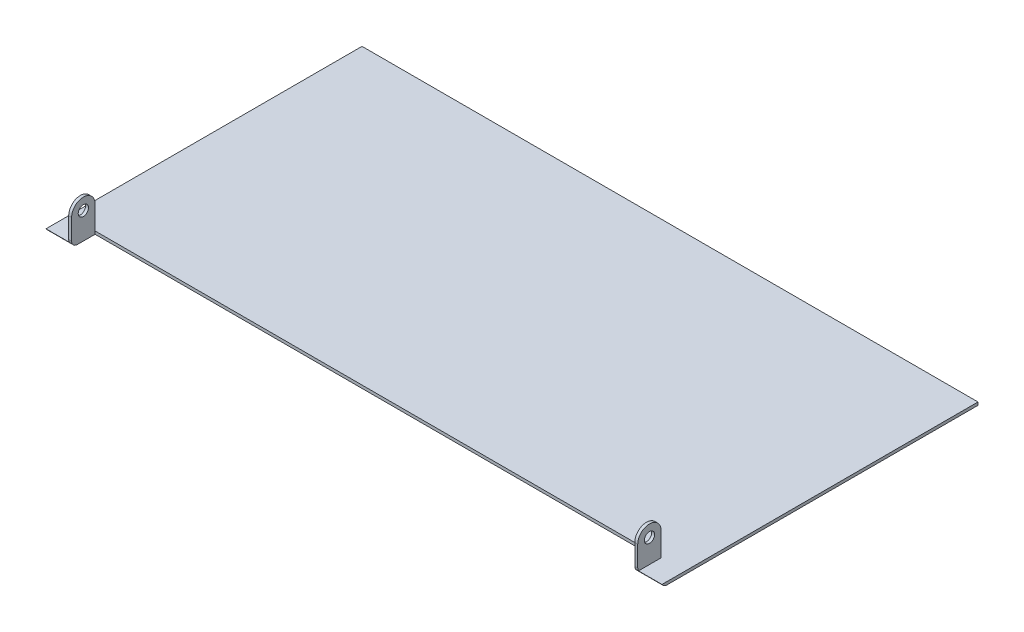
ISO-10303-21;
HEADER;
FILE_DESCRIPTION(('STEP AP214'),'2;1');
FILE_NAME('part.step','',(''),(''),'','','');
FILE_SCHEMA(('AUTOMOTIVE_DESIGN { 1 0 10303 214 1 1 1 1 }'));
ENDSEC;
DATA;
#1=APPLICATION_CONTEXT('core data for automotive mechanical design processes');
#2=APPLICATION_PROTOCOL_DEFINITION('international standard','automotive_design',2000,#1);
#3=PRODUCT_CONTEXT('',#1,'mechanical');
#4=PRODUCT('Part','Part','',(#3));
#5=PRODUCT_RELATED_PRODUCT_CATEGORY('part','',(#4));
#6=PRODUCT_DEFINITION_FORMATION('','',#4);
#7=PRODUCT_DEFINITION_CONTEXT('part definition',#1,'design');
#8=PRODUCT_DEFINITION('design','',#6,#7);
#9=PRODUCT_DEFINITION_SHAPE('','',#8);
#10=(LENGTH_UNIT() NAMED_UNIT(*) SI_UNIT(.MILLI.,.METRE.));
#11=(NAMED_UNIT(*) PLANE_ANGLE_UNIT() SI_UNIT($,.RADIAN.));
#12=(NAMED_UNIT(*) SI_UNIT($,.STERADIAN.) SOLID_ANGLE_UNIT());
#13=UNCERTAINTY_MEASURE_WITH_UNIT(LENGTH_MEASURE(1.E-05),#10,'distance_accuracy_value','');
#14=(GEOMETRIC_REPRESENTATION_CONTEXT(3) GLOBAL_UNCERTAINTY_ASSIGNED_CONTEXT((#13)) GLOBAL_UNIT_ASSIGNED_CONTEXT((#10,
#11,#12)) REPRESENTATION_CONTEXT('',''));
#15=CARTESIAN_POINT('',(0.,0.,0.));
#16=DIRECTION('',(0.,0.,1.));
#17=DIRECTION('',(1.,0.,0.));
#18=AXIS2_PLACEMENT_3D('',#15,#16,#17);
#19=CARTESIAN_POINT('',(0.,0.,0.));
#20=DIRECTION('',(0.,1.,0.));
#21=DIRECTION('',(0.,0.,1.));
#22=AXIS2_PLACEMENT_3D('',#19,#20,#21);
#23=PLANE('',#22);
#24=DIRECTION('',(-1.,0.,0.));
#25=VECTOR('',#24,1.);
#26=CARTESIAN_POINT('',(105.000025,0.,56.));
#27=LINE('',#26,#25);
#28=CARTESIAN_POINT('',(-96.,0.,56.));
#29=VERTEX_POINT('',#28);
#30=CARTESIAN_POINT('',(-105.,0.,56.));
#31=VERTEX_POINT('',#30);
#32=EDGE_CURVE('E143',#29,#31,#27,.T.);
#33=ORIENTED_EDGE('',*,*,#32,.T.);
#34=DIRECTION('',(0.,0.,1.));
#35=VECTOR('',#34,1.);
#36=CARTESIAN_POINT('',(-105.,0.,-50.));
#37=LINE('',#36,#35);
#38=CARTESIAN_POINT('',(-105.,0.,-50.));
#39=VERTEX_POINT('',#38);
#40=EDGE_CURVE('E155',#39,#31,#37,.T.);
#41=ORIENTED_EDGE('',*,*,#40,.F.);
#42=DIRECTION('',(-1.,0.,0.));
#43=VECTOR('',#42,1.);
#44=CARTESIAN_POINT('',(97.,0.,-50.));
#45=LINE('',#44,#43);
#46=CARTESIAN_POINT('',(105.,0.,-50.));
#47=VERTEX_POINT('',#46);
#48=EDGE_CURVE('E233',#47,#39,#45,.T.);
#49=ORIENTED_EDGE('',*,*,#48,.F.);
#50=DIRECTION('',(0.,0.,-1.));
#51=VECTOR('',#50,1.);
#52=CARTESIAN_POINT('',(105.,0.,-50.));
#53=LINE('',#52,#51);
#54=CARTESIAN_POINT('',(105.0000025,0.,56.));
#55=VERTEX_POINT('',#54);
#56=EDGE_CURVE('E39',#55,#47,#53,.T.);
#57=ORIENTED_EDGE('',*,*,#56,.F.);
#58=CARTESIAN_POINT('',(96.,0.,56.));
#59=VERTEX_POINT('',#58);
#60=EDGE_CURVE('E59',#55,#59,#27,.T.);
#61=ORIENTED_EDGE('',*,*,#60,.T.);
#62=DIRECTION('',(0.,0.,1.));
#63=VECTOR('',#62,1.);
#64=CARTESIAN_POINT('',(96.,0.,58.));
#65=LINE('',#64,#63);
#66=CARTESIAN_POINT('',(96.,0.,50.));
#67=VERTEX_POINT('',#66);
#68=EDGE_CURVE('E187',#67,#59,#65,.T.);
#69=ORIENTED_EDGE('',*,*,#68,.F.);
#70=DIRECTION('',(1.,0.,0.));
#71=VECTOR('',#70,1.);
#72=CARTESIAN_POINT('',(97.,0.,50.));
#73=LINE('',#72,#71);
#74=CARTESIAN_POINT('',(-96.,0.,50.));
#75=VERTEX_POINT('',#74);
#76=EDGE_CURVE('E225',#75,#67,#73,.T.);
#77=ORIENTED_EDGE('',*,*,#76,.F.);
#78=DIRECTION('',(0.,0.,1.));
#79=VECTOR('',#78,1.);
#80=CARTESIAN_POINT('',(-96.,0.,58.));
#81=LINE('',#80,#79);
#82=EDGE_CURVE('E157',#75,#29,#81,.T.);
#83=ORIENTED_EDGE('',*,*,#82,.T.);
#84=EDGE_LOOP('',(#33,#41,#49,#57,#61,#69,#77,#83));
#85=FACE_BOUND('',#84,.T.);
#86=ADVANCED_FACE('F35',(#85),#23,.F.);
#87=CARTESIAN_POINT('',(-96.,0.,58.));
#88=DIRECTION('',(0.,0.,1.));
#89=DIRECTION('',(1.,0.,0.));
#90=AXIS2_PLACEMENT_3D('',#87,#88,#89);
#91=PLANE('',#90);
#92=DIRECTION('',(0.,1.,0.));
#93=VECTOR('',#92,1.);
#94=CARTESIAN_POINT('',(-97.,0.,58.));
#95=LINE('',#94,#93);
#96=CARTESIAN_POINT('',(-97.,2.,58.));
#97=VERTEX_POINT('',#96);
#98=CARTESIAN_POINT('',(-97.,9.,58.));
#99=VERTEX_POINT('',#98);
#100=EDGE_CURVE('E177',#97,#99,#95,.T.);
#101=ORIENTED_EDGE('',*,*,#100,.F.);
#102=DIRECTION('',(-1.,0.,0.));
#103=VECTOR('',#102,1.);
#104=CARTESIAN_POINT('',(105.000025,2.,58.));
#105=LINE('',#104,#103);
#106=CARTESIAN_POINT('',(-96.,2.,58.));
#107=VERTEX_POINT('',#106);
#108=EDGE_CURVE('E149',#107,#97,#105,.T.);
#109=ORIENTED_EDGE('',*,*,#108,.F.);
#110=DIRECTION('',(0.,1.,0.));
#111=VECTOR('',#110,1.);
#112=CARTESIAN_POINT('',(-96.,0.,58.));
#113=LINE('',#112,#111);
#114=CARTESIAN_POINT('',(-96.,9.,58.));
#115=VERTEX_POINT('',#114);
#116=EDGE_CURVE('E208',#107,#115,#113,.T.);
#117=ORIENTED_EDGE('',*,*,#116,.T.);
#118=DIRECTION('',(-1.,0.,0.));
#119=VECTOR('',#118,1.);
#120=CARTESIAN_POINT('',(-96.,9.,58.));
#121=LINE('',#120,#119);
#122=EDGE_CURVE('E217',#115,#99,#121,.T.);
#123=ORIENTED_EDGE('',*,*,#122,.T.);
#124=EDGE_LOOP('',(#101,#109,#117,#123));
#125=FACE_BOUND('',#124,.T.);
#126=ADVANCED_FACE('F278',(#125),#91,.T.);
#127=CARTESIAN_POINT('',(97.,1.,50.));
#128=DIRECTION('',(-1.,0.,0.));
#129=DIRECTION('',(0.,0.,1.));
#130=AXIS2_PLACEMENT_3D('',#127,#128,#129);
#131=PLANE('',#130);
#132=CARTESIAN_POINT('',(97.,9.,54.));
#133=DIRECTION('',(-1.,0.,0.));
#134=DIRECTION('',(0.,0.,1.));
#135=AXIS2_PLACEMENT_3D('',#132,#133,#134);
#136=CIRCLE('',#135,1.75);
#137=CARTESIAN_POINT('',(97.,9.,55.75));
#138=VERTEX_POINT('',#137);
#139=EDGE_CURVE('E166',#138,#138,#136,.T.);
#140=ORIENTED_EDGE('',*,*,#139,.T.);
#141=EDGE_LOOP('',(#140));
#142=FACE_BOUND('',#141,.T.);
#143=DIRECTION('',(0.,1.,0.));
#144=VECTOR('',#143,1.);
#145=CARTESIAN_POINT('',(97.,0.,58.));
#146=LINE('',#145,#144);
#147=CARTESIAN_POINT('',(97.,2.,58.));
#148=VERTEX_POINT('',#147);
#149=CARTESIAN_POINT('',(97.,9.,58.));
#150=VERTEX_POINT('',#149);
#151=EDGE_CURVE('E185',#148,#150,#146,.T.);
#152=ORIENTED_EDGE('',*,*,#151,.F.);
#153=CARTESIAN_POINT('',(97.,2.00000000000002,56.));
#154=DIRECTION('',(-1.,0.,0.));
#155=DIRECTION('',(0.,0.,1.));
#156=AXIS2_PLACEMENT_3D('',#153,#154,#155);
#157=CIRCLE('',#156,2.00000000000002);
#158=CARTESIAN_POINT('',(97.,1.,57.7320508075689));
#159=VERTEX_POINT('',#158);
#160=EDGE_CURVE('E270',#148,#159,#157,.F.);
#161=ORIENTED_EDGE('',*,*,#160,.T.);
#162=DIRECTION('',(0.,0.,1.));
#163=VECTOR('',#162,1.);
#164=CARTESIAN_POINT('',(97.,1.,-50.));
#165=LINE('',#164,#163);
#166=CARTESIAN_POINT('',(97.,1.,50.));
#167=VERTEX_POINT('',#166);
#168=EDGE_CURVE('E45',#167,#159,#165,.T.);
#169=ORIENTED_EDGE('',*,*,#168,.F.);
#170=DIRECTION('',(0.,-1.,0.));
#171=VECTOR('',#170,1.);
#172=CARTESIAN_POINT('',(97.,0.,50.));
#173=LINE('',#172,#171);
#174=CARTESIAN_POINT('',(97.,9.,50.));
#175=VERTEX_POINT('',#174);
#176=EDGE_CURVE('E328',#175,#167,#173,.T.);
#177=ORIENTED_EDGE('',*,*,#176,.F.);
#178=CARTESIAN_POINT('',(97.,9.,54.));
#179=DIRECTION('',(-1.,0.,0.));
#180=DIRECTION('',(0.,0.,-1.));
#181=AXIS2_PLACEMENT_3D('',#178,#179,#180);
#182=CIRCLE('',#181,4.);
#183=EDGE_CURVE('E188',#150,#175,#182,.T.);
#184=ORIENTED_EDGE('',*,*,#183,.F.);
#185=EDGE_LOOP('',(#152,#161,#169,#177,#184));
#186=FACE_BOUND('',#185,.T.);
#187=ADVANCED_FACE('F330',(#142,#186),#131,.F.);
#188=CARTESIAN_POINT('',(-97.,1.,50.));
#189=DIRECTION('',(1.,0.,0.));
#190=DIRECTION('',(0.,0.,-1.));
#191=AXIS2_PLACEMENT_3D('',#188,#189,#190);
#192=PLANE('',#191);
#193=CARTESIAN_POINT('',(-97.,9.,54.));
#194=DIRECTION('',(-1.,0.,0.));
#195=DIRECTION('',(0.,0.,1.));
#196=AXIS2_PLACEMENT_3D('',#193,#194,#195);
#197=CIRCLE('',#196,1.75);
#198=CARTESIAN_POINT('',(-97.,9.,55.75));
#199=VERTEX_POINT('',#198);
#200=EDGE_CURVE('E204',#199,#199,#197,.T.);
#201=ORIENTED_EDGE('',*,*,#200,.F.);
#202=EDGE_LOOP('',(#201));
#203=FACE_BOUND('',#202,.T.);
#204=DIRECTION('',(0.,0.,-1.));
#205=VECTOR('',#204,1.);
#206=CARTESIAN_POINT('',(-97.,1.,-50.));
#207=LINE('',#206,#205);
#208=CARTESIAN_POINT('',(-97.,1.,57.7320508075689));
#209=VERTEX_POINT('',#208);
#210=CARTESIAN_POINT('',(-97.,1.,50.));
#211=VERTEX_POINT('',#210);
#212=EDGE_CURVE('E168',#209,#211,#207,.T.);
#213=ORIENTED_EDGE('',*,*,#212,.F.);
#214=CARTESIAN_POINT('',(-97.,2.00000000000002,56.));
#215=DIRECTION('',(1.,0.,0.));
#216=DIRECTION('',(0.,0.,-1.));
#217=AXIS2_PLACEMENT_3D('',#214,#215,#216);
#218=CIRCLE('',#217,2.00000000000002);
#219=EDGE_CURVE('E252',#209,#97,#218,.F.);
#220=ORIENTED_EDGE('',*,*,#219,.T.);
#221=ORIENTED_EDGE('',*,*,#100,.T.);
#222=CARTESIAN_POINT('',(-97.,9.,54.));
#223=DIRECTION('',(-1.,0.,0.));
#224=DIRECTION('',(0.,0.,-1.));
#225=AXIS2_PLACEMENT_3D('',#222,#223,#224);
#226=CIRCLE('',#225,4.);
#227=CARTESIAN_POINT('',(-97.,9.,50.));
#228=VERTEX_POINT('',#227);
#229=EDGE_CURVE('E220',#99,#228,#226,.T.);
#230=ORIENTED_EDGE('',*,*,#229,.T.);
#231=DIRECTION('',(0.,-1.,0.));
#232=VECTOR('',#231,1.);
#233=CARTESIAN_POINT('',(-97.,0.,50.));
#234=LINE('',#233,#232);
#235=EDGE_CURVE('E209',#228,#211,#234,.T.);
#236=ORIENTED_EDGE('',*,*,#235,.T.);
#237=EDGE_LOOP('',(#213,#220,#221,#230,#236));
#238=FACE_BOUND('',#237,.T.);
#239=ADVANCED_FACE('F37',(#203,#238),#192,.F.);
#240=CARTESIAN_POINT('',(97.,1.,50.));
#241=DIRECTION('',(0.,0.,-1.));
#242=DIRECTION('',(-1.,0.,0.));
#243=AXIS2_PLACEMENT_3D('',#240,#241,#242);
#244=PLANE('',#243);
#245=ORIENTED_EDGE('',*,*,#76,.T.);
#246=DIRECTION('',(0.,-1.,0.));
#247=VECTOR('',#246,1.);
#248=CARTESIAN_POINT('',(96.,0.,50.));
#249=LINE('',#248,#247);
#250=CARTESIAN_POINT('',(96.,1.,50.));
#251=VERTEX_POINT('',#250);
#252=EDGE_CURVE('E299',#251,#67,#249,.T.);
#253=ORIENTED_EDGE('',*,*,#252,.F.);
#254=DIRECTION('',(1.,0.,0.));
#255=VECTOR('',#254,1.);
#256=CARTESIAN_POINT('',(97.,1.,50.));
#257=LINE('',#256,#255);
#258=CARTESIAN_POINT('',(-96.,1.,50.));
#259=VERTEX_POINT('',#258);
#260=EDGE_CURVE('E228',#259,#251,#257,.T.);
#261=ORIENTED_EDGE('',*,*,#260,.F.);
#262=DIRECTION('',(0.,-1.,0.));
#263=VECTOR('',#262,1.);
#264=CARTESIAN_POINT('',(-96.,0.,50.));
#265=LINE('',#264,#263);
#266=EDGE_CURVE('E214',#259,#75,#265,.T.);
#267=ORIENTED_EDGE('',*,*,#266,.T.);
#268=EDGE_LOOP('',(#245,#253,#261,#267));
#269=FACE_BOUND('',#268,.T.);
#270=ADVANCED_FACE('F297',(#269),#244,.F.);
#271=CARTESIAN_POINT('',(97.,1.,-50.));
#272=DIRECTION('',(0.,0.,1.));
#273=DIRECTION('',(1.,0.,0.));
#274=AXIS2_PLACEMENT_3D('',#271,#272,#273);
#275=PLANE('',#274);
#276=ORIENTED_EDGE('',*,*,#48,.T.);
#277=DIRECTION('',(0.,1.,0.));
#278=VECTOR('',#277,1.);
#279=CARTESIAN_POINT('',(-105.,0.,-50.));
#280=LINE('',#279,#278);
#281=CARTESIAN_POINT('',(-105.,1.,-50.));
#282=VERTEX_POINT('',#281);
#283=EDGE_CURVE('E163',#39,#282,#280,.T.);
#284=ORIENTED_EDGE('',*,*,#283,.T.);
#285=DIRECTION('',(-1.,0.,0.));
#286=VECTOR('',#285,1.);
#287=CARTESIAN_POINT('',(97.,1.,-50.));
#288=LINE('',#287,#286);
#289=CARTESIAN_POINT('',(105.,1.,-50.));
#290=VERTEX_POINT('',#289);
#291=EDGE_CURVE('E234',#290,#282,#288,.T.);
#292=ORIENTED_EDGE('',*,*,#291,.F.);
#293=DIRECTION('',(0.,1.,0.));
#294=VECTOR('',#293,1.);
#295=CARTESIAN_POINT('',(105.,0.,-50.));
#296=LINE('',#295,#294);
#297=EDGE_CURVE('E172',#47,#290,#296,.T.);
#298=ORIENTED_EDGE('',*,*,#297,.F.);
#299=EDGE_LOOP('',(#276,#284,#292,#298));
#300=FACE_BOUND('',#299,.T.);
#301=ADVANCED_FACE('F338',(#300),#275,.F.);
#302=CARTESIAN_POINT('',(0.,1.,0.));
#303=DIRECTION('',(0.,1.,0.));
#304=DIRECTION('',(0.,0.,1.));
#305=AXIS2_PLACEMENT_3D('',#302,#303,#304);
#306=PLANE('',#305);
#307=DIRECTION('',(-1.,0.,0.));
#308=VECTOR('',#307,1.);
#309=CARTESIAN_POINT('',(105.000025,1.,57.7320508075689));
#310=LINE('',#309,#308);
#311=CARTESIAN_POINT('',(105.,1.,57.7320508075689));
#312=VERTEX_POINT('',#311);
#313=EDGE_CURVE('E264',#312,#159,#310,.T.);
#314=ORIENTED_EDGE('',*,*,#313,.F.);
#315=DIRECTION('',(0.,0.,-1.));
#316=VECTOR('',#315,1.);
#317=CARTESIAN_POINT('',(105.,1.,-50.));
#318=LINE('',#317,#316);
#319=EDGE_CURVE('E251',#312,#290,#318,.T.);
#320=ORIENTED_EDGE('',*,*,#319,.T.);
#321=ORIENTED_EDGE('',*,*,#291,.T.);
#322=DIRECTION('',(0.,0.,1.));
#323=VECTOR('',#322,1.);
#324=CARTESIAN_POINT('',(-105.,1.,-50.));
#325=LINE('',#324,#323);
#326=CARTESIAN_POINT('',(-105.,1.,57.7320508075689));
#327=VERTEX_POINT('',#326);
#328=EDGE_CURVE('E164',#282,#327,#325,.T.);
#329=ORIENTED_EDGE('',*,*,#328,.T.);
#330=EDGE_CURVE('E52',#209,#327,#310,.T.);
#331=ORIENTED_EDGE('',*,*,#330,.F.);
#332=ORIENTED_EDGE('',*,*,#212,.T.);
#333=EDGE_CURVE('E232',#211,#259,#257,.T.);
#334=ORIENTED_EDGE('',*,*,#333,.T.);
#335=ORIENTED_EDGE('',*,*,#260,.T.);
#336=DIRECTION('',(1.,0.,0.));
#337=VECTOR('',#336,1.);
#338=CARTESIAN_POINT('',(0.,1.,50.));
#339=LINE('',#338,#337);
#340=EDGE_CURVE('E196',#251,#167,#339,.T.);
#341=ORIENTED_EDGE('',*,*,#340,.T.);
#342=ORIENTED_EDGE('',*,*,#168,.T.);
#343=EDGE_LOOP('',(#314,#320,#321,#329,#331,#332,#334,#335,#341,#342));
#344=FACE_BOUND('',#343,.T.);
#345=ADVANCED_FACE('F292',(#344),#306,.T.);
#346=CARTESIAN_POINT('',(-96.,0.,50.));
#347=DIRECTION('',(0.,0.,-1.));
#348=DIRECTION('',(-1.,0.,0.));
#349=AXIS2_PLACEMENT_3D('',#346,#347,#348);
#350=PLANE('',#349);
#351=CARTESIAN_POINT('',(-96.,9.,50.));
#352=VERTEX_POINT('',#351);
#353=EDGE_CURVE('E215',#352,#259,#265,.T.);
#354=ORIENTED_EDGE('',*,*,#353,.T.);
#355=ORIENTED_EDGE('',*,*,#333,.F.);
#356=ORIENTED_EDGE('',*,*,#235,.F.);
#357=DIRECTION('',(-1.,0.,0.));
#358=VECTOR('',#357,1.);
#359=CARTESIAN_POINT('',(-96.,9.,50.));
#360=LINE('',#359,#358);
#361=EDGE_CURVE('E223',#352,#228,#360,.T.);
#362=ORIENTED_EDGE('',*,*,#361,.F.);
#363=EDGE_LOOP('',(#354,#355,#356,#362));
#364=FACE_BOUND('',#363,.T.);
#365=ADVANCED_FACE('F291',(#364),#350,.T.);
#366=CARTESIAN_POINT('',(-96.,9.,54.));
#367=DIRECTION('',(-1.,0.,0.));
#368=DIRECTION('',(0.,0.,1.));
#369=AXIS2_PLACEMENT_3D('',#366,#367,#368);
#370=CYLINDRICAL_SURFACE('',#369,4.);
#371=ORIENTED_EDGE('',*,*,#229,.F.);
#372=ORIENTED_EDGE('',*,*,#122,.F.);
#373=CARTESIAN_POINT('',(-96.,9.,54.));
#374=DIRECTION('',(-1.,0.,0.));
#375=DIRECTION('',(0.,0.,-1.));
#376=AXIS2_PLACEMENT_3D('',#373,#374,#375);
#377=CIRCLE('',#376,4.);
#378=EDGE_CURVE('E211',#115,#352,#377,.T.);
#379=ORIENTED_EDGE('',*,*,#378,.T.);
#380=ORIENTED_EDGE('',*,*,#361,.T.);
#381=EDGE_LOOP('',(#371,#372,#379,#380));
#382=FACE_BOUND('',#381,.T.);
#383=ADVANCED_FACE('F287',(#382),#370,.T.);
#384=CARTESIAN_POINT('',(-96.,9.,54.));
#385=DIRECTION('',(1.,0.,0.));
#386=DIRECTION('',(0.,0.,-1.));
#387=AXIS2_PLACEMENT_3D('',#384,#385,#386);
#388=PLANE('',#387);
#389=CARTESIAN_POINT('',(-96.,2.00000000000002,56.));
#390=DIRECTION('',(1.,0.,0.));
#391=DIRECTION('',(0.,0.,-1.));
#392=AXIS2_PLACEMENT_3D('',#389,#390,#391);
#393=CIRCLE('',#392,2.00000000000002);
#394=EDGE_CURVE('E262',#29,#107,#393,.F.);
#395=ORIENTED_EDGE('',*,*,#394,.F.);
#396=ORIENTED_EDGE('',*,*,#82,.F.);
#397=ORIENTED_EDGE('',*,*,#266,.F.);
#398=ORIENTED_EDGE('',*,*,#353,.F.);
#399=ORIENTED_EDGE('',*,*,#378,.F.);
#400=ORIENTED_EDGE('',*,*,#116,.F.);
#401=EDGE_LOOP('',(#395,#396,#397,#398,#399,#400));
#402=FACE_BOUND('',#401,.T.);
#403=CARTESIAN_POINT('',(-96.,9.,54.));
#404=DIRECTION('',(-1.,0.,0.));
#405=DIRECTION('',(0.,0.,1.));
#406=AXIS2_PLACEMENT_3D('',#403,#404,#405);
#407=CIRCLE('',#406,1.75);
#408=CARTESIAN_POINT('',(-96.,9.,55.75));
#409=VERTEX_POINT('',#408);
#410=EDGE_CURVE('E201',#409,#409,#407,.T.);
#411=ORIENTED_EDGE('',*,*,#410,.T.);
#412=EDGE_LOOP('',(#411));
#413=FACE_BOUND('',#412,.T.);
#414=ADVANCED_FACE('F281',(#402,#413),#388,.T.);
#415=CARTESIAN_POINT('',(-96.,9.,54.));
#416=DIRECTION('',(-1.,0.,0.));
#417=DIRECTION('',(0.,0.,1.));
#418=AXIS2_PLACEMENT_3D('',#415,#416,#417);
#419=CYLINDRICAL_SURFACE('',#418,1.75);
#420=ORIENTED_EDGE('',*,*,#410,.F.);
#421=EDGE_LOOP('',(#420));
#422=FACE_BOUND('',#421,.T.);
#423=ORIENTED_EDGE('',*,*,#200,.T.);
#424=EDGE_LOOP('',(#423));
#425=FACE_BOUND('',#424,.T.);
#426=ADVANCED_FACE('F360',(#422,#425),#419,.F.);
#427=CARTESIAN_POINT('',(96.,9.,54.));
#428=DIRECTION('',(-1.,0.,0.));
#429=DIRECTION('',(0.,0.,-1.));
#430=AXIS2_PLACEMENT_3D('',#427,#428,#429);
#431=PLANE('',#430);
#432=CARTESIAN_POINT('',(96.,2.00000000000002,56.));
#433=DIRECTION('',(-1.,0.,0.));
#434=DIRECTION('',(0.,0.,1.));
#435=AXIS2_PLACEMENT_3D('',#432,#433,#434);
#436=CIRCLE('',#435,2.00000000000002);
#437=CARTESIAN_POINT('',(96.,2.,58.));
#438=VERTEX_POINT('',#437);
#439=EDGE_CURVE('E272',#438,#59,#436,.F.);
#440=ORIENTED_EDGE('',*,*,#439,.F.);
#441=DIRECTION('',(0.,1.,0.));
#442=VECTOR('',#441,1.);
#443=CARTESIAN_POINT('',(96.,0.,58.));
#444=LINE('',#443,#442);
#445=CARTESIAN_POINT('',(96.,9.,58.));
#446=VERTEX_POINT('',#445);
#447=EDGE_CURVE('E200',#438,#446,#444,.T.);
#448=ORIENTED_EDGE('',*,*,#447,.T.);
#449=CARTESIAN_POINT('',(96.,9.,54.));
#450=DIRECTION('',(-1.,0.,0.));
#451=DIRECTION('',(0.,0.,-1.));
#452=AXIS2_PLACEMENT_3D('',#449,#450,#451);
#453=CIRCLE('',#452,4.);
#454=CARTESIAN_POINT('',(96.,9.,50.));
#455=VERTEX_POINT('',#454);
#456=EDGE_CURVE('E306',#446,#455,#453,.T.);
#457=ORIENTED_EDGE('',*,*,#456,.T.);
#458=EDGE_CURVE('E304',#455,#251,#249,.T.);
#459=ORIENTED_EDGE('',*,*,#458,.T.);
#460=ORIENTED_EDGE('',*,*,#252,.T.);
#461=ORIENTED_EDGE('',*,*,#68,.T.);
#462=EDGE_LOOP('',(#440,#448,#457,#459,#460,#461));
#463=FACE_BOUND('',#462,.T.);
#464=CARTESIAN_POINT('',(96.,9.,54.));
#465=DIRECTION('',(-1.,0.,0.));
#466=DIRECTION('',(0.,0.,1.));
#467=AXIS2_PLACEMENT_3D('',#464,#465,#466);
#468=CIRCLE('',#467,1.75);
#469=CARTESIAN_POINT('',(96.,9.,55.75));
#470=VERTEX_POINT('',#469);
#471=EDGE_CURVE('E541',#470,#470,#468,.T.);
#472=ORIENTED_EDGE('',*,*,#471,.F.);
#473=EDGE_LOOP('',(#472));
#474=FACE_BOUND('',#473,.T.);
#475=ADVANCED_FACE('F312',(#463,#474),#431,.T.);
#476=CARTESIAN_POINT('',(96.,0.,58.));
#477=DIRECTION('',(0.,0.,-1.));
#478=DIRECTION('',(-1.,0.,0.));
#479=AXIS2_PLACEMENT_3D('',#476,#477,#478);
#480=PLANE('',#479);
#481=ORIENTED_EDGE('',*,*,#447,.F.);
#482=EDGE_CURVE('E158',#148,#438,#105,.T.);
#483=ORIENTED_EDGE('',*,*,#482,.F.);
#484=ORIENTED_EDGE('',*,*,#151,.T.);
#485=DIRECTION('',(1.,0.,0.));
#486=VECTOR('',#485,1.);
#487=CARTESIAN_POINT('',(96.,9.,58.));
#488=LINE('',#487,#486);
#489=EDGE_CURVE('E193',#446,#150,#488,.T.);
#490=ORIENTED_EDGE('',*,*,#489,.F.);
#491=EDGE_LOOP('',(#481,#483,#484,#490));
#492=FACE_BOUND('',#491,.T.);
#493=ADVANCED_FACE('F318',(#492),#480,.F.);
#494=CARTESIAN_POINT('',(96.,9.,54.));
#495=DIRECTION('',(1.,0.,0.));
#496=DIRECTION('',(0.,0.,-1.));
#497=AXIS2_PLACEMENT_3D('',#494,#495,#496);
#498=CYLINDRICAL_SURFACE('',#497,4.);
#499=ORIENTED_EDGE('',*,*,#183,.T.);
#500=DIRECTION('',(1.,0.,0.));
#501=VECTOR('',#500,1.);
#502=CARTESIAN_POINT('',(96.,9.,50.));
#503=LINE('',#502,#501);
#504=EDGE_CURVE('E197',#455,#175,#503,.T.);
#505=ORIENTED_EDGE('',*,*,#504,.F.);
#506=ORIENTED_EDGE('',*,*,#456,.F.);
#507=ORIENTED_EDGE('',*,*,#489,.T.);
#508=EDGE_LOOP('',(#499,#505,#506,#507));
#509=FACE_BOUND('',#508,.T.);
#510=ADVANCED_FACE('F322',(#509),#498,.T.);
#511=CARTESIAN_POINT('',(96.,0.,50.));
#512=DIRECTION('',(0.,0.,1.));
#513=DIRECTION('',(1.,0.,0.));
#514=AXIS2_PLACEMENT_3D('',#511,#512,#513);
#515=PLANE('',#514);
#516=ORIENTED_EDGE('',*,*,#340,.F.);
#517=ORIENTED_EDGE('',*,*,#458,.F.);
#518=ORIENTED_EDGE('',*,*,#504,.T.);
#519=ORIENTED_EDGE('',*,*,#176,.T.);
#520=EDGE_LOOP('',(#516,#517,#518,#519));
#521=FACE_BOUND('',#520,.T.);
#522=ADVANCED_FACE('F327',(#521),#515,.F.);
#523=CARTESIAN_POINT('',(96.,9.,54.));
#524=DIRECTION('',(1.,0.,0.));
#525=DIRECTION('',(0.,0.,-1.));
#526=AXIS2_PLACEMENT_3D('',#523,#524,#525);
#527=CYLINDRICAL_SURFACE('',#526,1.75);
#528=ORIENTED_EDGE('',*,*,#471,.T.);
#529=EDGE_LOOP('',(#528));
#530=FACE_BOUND('',#529,.T.);
#531=ORIENTED_EDGE('',*,*,#139,.F.);
#532=EDGE_LOOP('',(#531));
#533=FACE_BOUND('',#532,.T.);
#534=ADVANCED_FACE('F366',(#530,#533),#527,.F.);
#535=CARTESIAN_POINT('',(-105.,0.,-50.));
#536=DIRECTION('',(-1.,0.,0.));
#537=DIRECTION('',(0.,0.,1.));
#538=AXIS2_PLACEMENT_3D('',#535,#536,#537);
#539=PLANE('',#538);
#540=CARTESIAN_POINT('',(-105.,2.00000000000002,56.));
#541=DIRECTION('',(1.,0.,0.));
#542=DIRECTION('',(0.,0.,1.));
#543=AXIS2_PLACEMENT_3D('',#540,#541,#542);
#544=CIRCLE('',#543,2.00000000000002);
#545=EDGE_CURVE('E140',#327,#31,#544,.T.);
#546=ORIENTED_EDGE('',*,*,#545,.F.);
#547=ORIENTED_EDGE('',*,*,#328,.F.);
#548=ORIENTED_EDGE('',*,*,#283,.F.);
#549=ORIENTED_EDGE('',*,*,#40,.T.);
#550=EDGE_LOOP('',(#546,#547,#548,#549));
#551=FACE_BOUND('',#550,.T.);
#552=ADVANCED_FACE('F161',(#551),#539,.T.);
#553=CARTESIAN_POINT('',(105.,0.,-50.));
#554=DIRECTION('',(1.,0.,0.));
#555=DIRECTION('',(0.,0.,-1.));
#556=AXIS2_PLACEMENT_3D('',#553,#554,#555);
#557=PLANE('',#556);
#558=CARTESIAN_POINT('',(105.,2.00000000000002,56.));
#559=DIRECTION('',(1.,0.,0.));
#560=DIRECTION('',(0.,0.,-1.));
#561=AXIS2_PLACEMENT_3D('',#558,#559,#560);
#562=CIRCLE('',#561,2.00000000000002);
#563=EDGE_CURVE('E11',#55,#312,#562,.F.);
#564=ORIENTED_EDGE('',*,*,#563,.F.);
#565=ORIENTED_EDGE('',*,*,#56,.T.);
#566=ORIENTED_EDGE('',*,*,#297,.T.);
#567=ORIENTED_EDGE('',*,*,#319,.F.);
#568=EDGE_LOOP('',(#564,#565,#566,#567));
#569=FACE_BOUND('',#568,.T.);
#570=ADVANCED_FACE('F334',(#569),#557,.T.);
#571=CARTESIAN_POINT('',(105.000025,2.00000000000002,56.));
#572=DIRECTION('',(-1.,0.,0.));
#573=DIRECTION('',(0.,0.,1.));
#574=AXIS2_PLACEMENT_3D('',#571,#572,#573);
#575=CYLINDRICAL_SURFACE('',#574,2.00000000000002);
#576=ORIENTED_EDGE('',*,*,#439,.T.);
#577=ORIENTED_EDGE('',*,*,#60,.F.);
#578=ORIENTED_EDGE('',*,*,#563,.T.);
#579=ORIENTED_EDGE('',*,*,#313,.T.);
#580=ORIENTED_EDGE('',*,*,#160,.F.);
#581=ORIENTED_EDGE('',*,*,#482,.T.);
#582=EDGE_LOOP('',(#576,#577,#578,#579,#580,#581));
#583=FACE_BOUND('',#582,.T.);
#584=ADVANCED_FACE('F331',(#583),#575,.T.);
#585=ORIENTED_EDGE('',*,*,#330,.T.);
#586=ORIENTED_EDGE('',*,*,#545,.T.);
#587=ORIENTED_EDGE('',*,*,#32,.F.);
#588=ORIENTED_EDGE('',*,*,#394,.T.);
#589=ORIENTED_EDGE('',*,*,#108,.T.);
#590=ORIENTED_EDGE('',*,*,#219,.F.);
#591=EDGE_LOOP('',(#585,#586,#587,#588,#589,#590));
#592=FACE_BOUND('',#591,.T.);
#593=ADVANCED_FACE('F142',(#592),#575,.T.);
#594=CLOSED_SHELL('',(#86,#126,#187,#239,#270,#301,#345,#365,#383,#414,#426,#475,#493,#510,#522,
#534,#552,#570,#584,#593));
#595=MANIFOLD_SOLID_BREP('B2',#594);
#596=ADVANCED_BREP_SHAPE_REPRESENTATION('',(#18,#595),#14);
#597=SHAPE_DEFINITION_REPRESENTATION(#9,#596);
ENDSEC;
END-ISO-10303-21;
